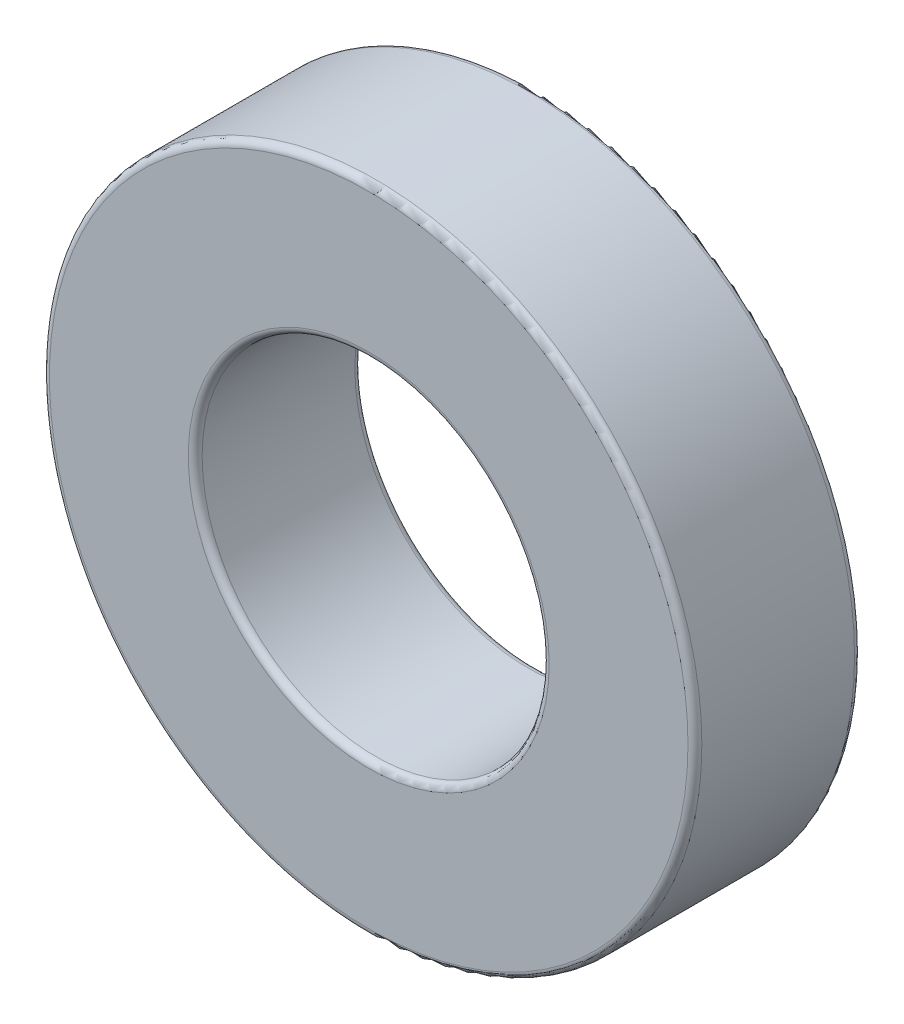
ISO-10303-21;
HEADER;
FILE_DESCRIPTION(('STEP AP214'),'2;1');
FILE_NAME('part.step','',(''),(''),'','','');
FILE_SCHEMA(('AUTOMOTIVE_DESIGN { 1 0 10303 214 1 1 1 1 }'));
ENDSEC;
DATA;
#1=APPLICATION_CONTEXT('core data for automotive mechanical design processes');
#2=APPLICATION_PROTOCOL_DEFINITION('international standard','automotive_design',2000,#1);
#3=PRODUCT_CONTEXT('',#1,'mechanical');
#4=PRODUCT('Part','Part','',(#3));
#5=PRODUCT_RELATED_PRODUCT_CATEGORY('part','',(#4));
#6=PRODUCT_DEFINITION_FORMATION('','',#4);
#7=PRODUCT_DEFINITION_CONTEXT('part definition',#1,'design');
#8=PRODUCT_DEFINITION('design','',#6,#7);
#9=PRODUCT_DEFINITION_SHAPE('','',#8);
#10=(LENGTH_UNIT() NAMED_UNIT(*) SI_UNIT(.MILLI.,.METRE.));
#11=(NAMED_UNIT(*) PLANE_ANGLE_UNIT() SI_UNIT($,.RADIAN.));
#12=(NAMED_UNIT(*) SI_UNIT($,.STERADIAN.) SOLID_ANGLE_UNIT());
#13=UNCERTAINTY_MEASURE_WITH_UNIT(LENGTH_MEASURE(1.E-05),#10,'distance_accuracy_value','');
#14=(GEOMETRIC_REPRESENTATION_CONTEXT(3) GLOBAL_UNCERTAINTY_ASSIGNED_CONTEXT((#13)) GLOBAL_UNIT_ASSIGNED_CONTEXT((#10,
#11,#12)) REPRESENTATION_CONTEXT('',''));
#15=CARTESIAN_POINT('',(0.,0.,0.));
#16=DIRECTION('',(0.,0.,1.));
#17=DIRECTION('',(1.,0.,0.));
#18=AXIS2_PLACEMENT_3D('',#15,#16,#17);
#19=CARTESIAN_POINT('',(0.,0.,12.));
#20=DIRECTION('',(0.,0.,1.));
#21=DIRECTION('',(1.,0.,0.));
#22=AXIS2_PLACEMENT_3D('',#19,#20,#21);
#23=PLANE('',#22);
#24=CARTESIAN_POINT('',(0.,0.,12.));
#25=DIRECTION('',(0.,0.,1.));
#26=DIRECTION('',(1.,0.,0.));
#27=AXIS2_PLACEMENT_3D('',#24,#25,#26);
#28=CIRCLE('',#27,13.);
#29=CARTESIAN_POINT('',(13.,0.,12.));
#30=VERTEX_POINT('',#29);
#31=EDGE_CURVE('E60',#30,#30,#28,.F.);
#32=ORIENTED_EDGE('',*,*,#31,.T.);
#33=EDGE_LOOP('',(#32));
#34=FACE_BOUND('',#33,.T.);
#35=CARTESIAN_POINT('',(0.,0.,12.));
#36=DIRECTION('',(0.,0.,1.));
#37=DIRECTION('',(1.,0.,0.));
#38=AXIS2_PLACEMENT_3D('',#35,#36,#37);
#39=CIRCLE('',#38,23.);
#40=CARTESIAN_POINT('',(23.,0.,12.));
#41=VERTEX_POINT('',#40);
#42=EDGE_CURVE('E65',#41,#41,#39,.T.);
#43=ORIENTED_EDGE('',*,*,#42,.T.);
#44=EDGE_LOOP('',(#43));
#45=FACE_BOUND('',#44,.T.);
#46=ADVANCED_FACE('F47',(#34,#45),#23,.T.);
#47=CARTESIAN_POINT('',(0.,0.,0.));
#48=DIRECTION('',(0.,0.,1.));
#49=DIRECTION('',(1.,0.,0.));
#50=AXIS2_PLACEMENT_3D('',#47,#48,#49);
#51=PLANE('',#50);
#52=CARTESIAN_POINT('',(0.,0.,0.));
#53=DIRECTION('',(0.,0.,1.));
#54=DIRECTION('',(1.,0.,0.));
#55=AXIS2_PLACEMENT_3D('',#52,#53,#54);
#56=CIRCLE('',#55,13.);
#57=CARTESIAN_POINT('',(13.,0.,0.));
#58=VERTEX_POINT('',#57);
#59=EDGE_CURVE('E79',#58,#58,#56,.T.);
#60=ORIENTED_EDGE('',*,*,#59,.T.);
#61=EDGE_LOOP('',(#60));
#62=FACE_BOUND('',#61,.T.);
#63=CARTESIAN_POINT('',(0.,0.,0.));
#64=DIRECTION('',(0.,0.,1.));
#65=DIRECTION('',(1.,0.,0.));
#66=AXIS2_PLACEMENT_3D('',#63,#64,#65);
#67=CIRCLE('',#66,23.);
#68=CARTESIAN_POINT('',(23.,0.,0.));
#69=VERTEX_POINT('',#68);
#70=EDGE_CURVE('E83',#69,#69,#67,.F.);
#71=ORIENTED_EDGE('',*,*,#70,.T.);
#72=EDGE_LOOP('',(#71));
#73=FACE_BOUND('',#72,.T.);
#74=ADVANCED_FACE('F88',(#62,#73),#51,.F.);
#75=CARTESIAN_POINT('',(0.,0.,12.));
#76=DIRECTION('',(0.,0.,-1.));
#77=DIRECTION('',(-1.,0.,0.));
#78=AXIS2_PLACEMENT_3D('',#75,#76,#77);
#79=CYLINDRICAL_SURFACE('',#78,23.5);
#80=CARTESIAN_POINT('',(0.,0.,0.5));
#81=DIRECTION('',(0.,0.,1.));
#82=DIRECTION('',(1.,0.,0.));
#83=AXIS2_PLACEMENT_3D('',#80,#81,#82);
#84=CIRCLE('',#83,23.5);
#85=CARTESIAN_POINT('',(23.5,0.,0.5));
#86=VERTEX_POINT('',#85);
#87=EDGE_CURVE('E10',#86,#86,#84,.T.);
#88=ORIENTED_EDGE('',*,*,#87,.T.);
#89=EDGE_LOOP('',(#88));
#90=FACE_BOUND('',#89,.T.);
#91=CARTESIAN_POINT('',(0.,0.,11.5));
#92=DIRECTION('',(0.,0.,1.));
#93=DIRECTION('',(1.,0.,0.));
#94=AXIS2_PLACEMENT_3D('',#91,#92,#93);
#95=CIRCLE('',#94,23.5);
#96=CARTESIAN_POINT('',(23.5,0.,11.5));
#97=VERTEX_POINT('',#96);
#98=EDGE_CURVE('E55',#97,#97,#95,.F.);
#99=ORIENTED_EDGE('',*,*,#98,.T.);
#100=EDGE_LOOP('',(#99));
#101=FACE_BOUND('',#100,.T.);
#102=ADVANCED_FACE('F108',(#90,#101),#79,.T.);
#103=CARTESIAN_POINT('',(0.,0.,12.));
#104=DIRECTION('',(0.,0.,-1.));
#105=DIRECTION('',(-1.,0.,0.));
#106=AXIS2_PLACEMENT_3D('',#103,#104,#105);
#107=CYLINDRICAL_SURFACE('',#106,12.5);
#108=CARTESIAN_POINT('',(0.,0.,0.5));
#109=DIRECTION('',(0.,0.,1.));
#110=DIRECTION('',(1.,0.,0.));
#111=AXIS2_PLACEMENT_3D('',#108,#109,#110);
#112=CIRCLE('',#111,12.5);
#113=CARTESIAN_POINT('',(12.5,0.,0.5));
#114=VERTEX_POINT('',#113);
#115=EDGE_CURVE('E71',#114,#114,#112,.F.);
#116=ORIENTED_EDGE('',*,*,#115,.T.);
#117=EDGE_LOOP('',(#116));
#118=FACE_BOUND('',#117,.T.);
#119=CARTESIAN_POINT('',(0.,0.,11.5));
#120=DIRECTION('',(0.,0.,1.));
#121=DIRECTION('',(1.,0.,0.));
#122=AXIS2_PLACEMENT_3D('',#119,#120,#121);
#123=CIRCLE('',#122,12.5);
#124=CARTESIAN_POINT('',(12.5,0.,11.5));
#125=VERTEX_POINT('',#124);
#126=EDGE_CURVE('E75',#125,#125,#123,.T.);
#127=ORIENTED_EDGE('',*,*,#126,.T.);
#128=EDGE_LOOP('',(#127));
#129=FACE_BOUND('',#128,.T.);
#130=ADVANCED_FACE('F113',(#118,#129),#107,.F.);
#131=CARTESIAN_POINT('',(0.,0.,0.5));
#132=DIRECTION('',(0.,0.,1.));
#133=DIRECTION('',(1.,0.,0.));
#134=AXIS2_PLACEMENT_3D('',#131,#132,#133);
#135=TOROIDAL_SURFACE('',#134,13.,0.5);
#136=ORIENTED_EDGE('',*,*,#115,.F.);
#137=EDGE_LOOP('',(#136));
#138=FACE_BOUND('',#137,.T.);
#139=ORIENTED_EDGE('',*,*,#59,.F.);
#140=EDGE_LOOP('',(#139));
#141=FACE_BOUND('',#140,.T.);
#142=ADVANCED_FACE('F99',(#138,#141),#135,.T.);
#143=CARTESIAN_POINT('',(0.,0.,11.5));
#144=DIRECTION('',(0.,0.,1.));
#145=DIRECTION('',(1.,0.,0.));
#146=AXIS2_PLACEMENT_3D('',#143,#144,#145);
#147=TOROIDAL_SURFACE('',#146,13.,0.5);
#148=ORIENTED_EDGE('',*,*,#31,.F.);
#149=EDGE_LOOP('',(#148));
#150=FACE_BOUND('',#149,.T.);
#151=ORIENTED_EDGE('',*,*,#126,.F.);
#152=EDGE_LOOP('',(#151));
#153=FACE_BOUND('',#152,.T.);
#154=ADVANCED_FACE('F93',(#150,#153),#147,.T.);
#155=CARTESIAN_POINT('',(0.,0.,0.5));
#156=DIRECTION('',(0.,0.,1.));
#157=DIRECTION('',(1.,0.,0.));
#158=AXIS2_PLACEMENT_3D('',#155,#156,#157);
#159=TOROIDAL_SURFACE('',#158,23.,0.5);
#160=ORIENTED_EDGE('',*,*,#70,.F.);
#161=EDGE_LOOP('',(#160));
#162=FACE_BOUND('',#161,.T.);
#163=ORIENTED_EDGE('',*,*,#87,.F.);
#164=EDGE_LOOP('',(#163));
#165=FACE_BOUND('',#164,.T.);
#166=ADVANCED_FACE('F90',(#162,#165),#159,.T.);
#167=CARTESIAN_POINT('',(0.,0.,11.5));
#168=DIRECTION('',(0.,0.,1.));
#169=DIRECTION('',(1.,0.,0.));
#170=AXIS2_PLACEMENT_3D('',#167,#168,#169);
#171=TOROIDAL_SURFACE('',#170,23.,0.5);
#172=ORIENTED_EDGE('',*,*,#98,.F.);
#173=EDGE_LOOP('',(#172));
#174=FACE_BOUND('',#173,.T.);
#175=ORIENTED_EDGE('',*,*,#42,.F.);
#176=EDGE_LOOP('',(#175));
#177=FACE_BOUND('',#176,.T.);
#178=ADVANCED_FACE('F49',(#174,#177),#171,.T.);
#179=CLOSED_SHELL('',(#46,#74,#102,#130,#142,#154,#166,#178));
#180=MANIFOLD_SOLID_BREP('B2',#179);
#181=ADVANCED_BREP_SHAPE_REPRESENTATION('',(#18,#180),#14);
#182=SHAPE_DEFINITION_REPRESENTATION(#9,#181);
ENDSEC;
END-ISO-10303-21;
